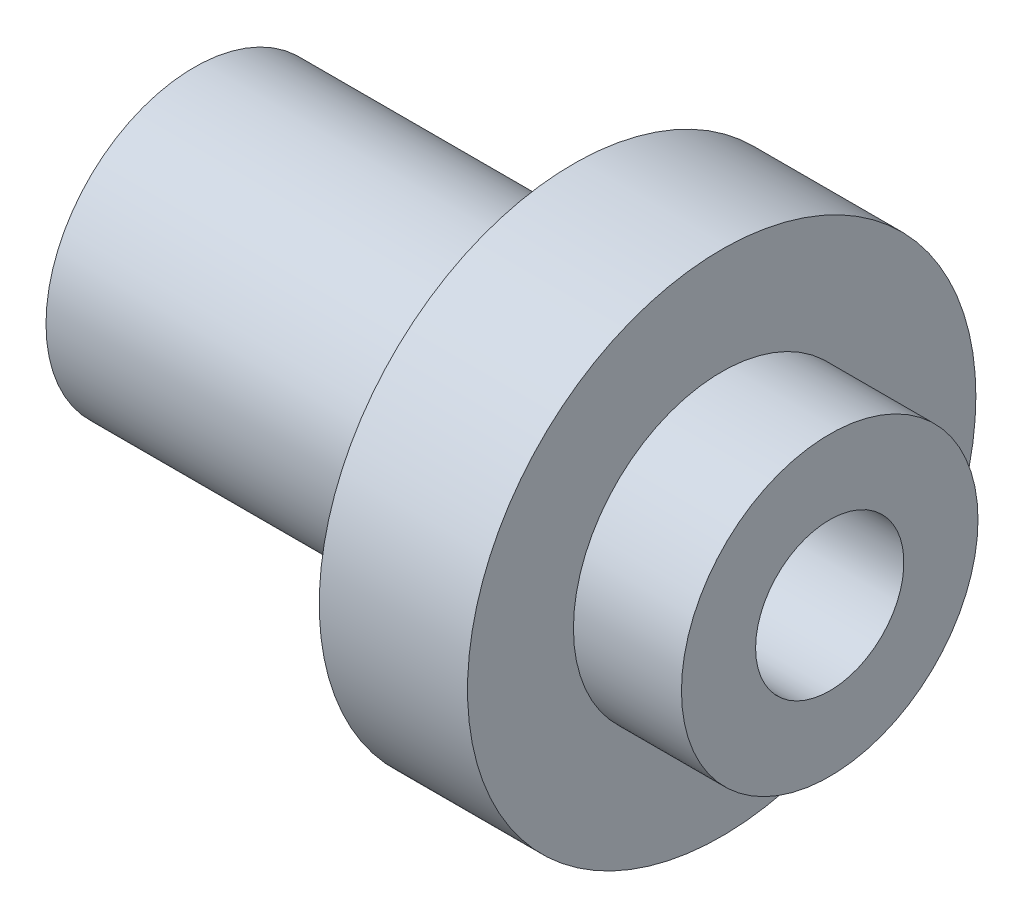
ISO-10303-21;
HEADER;
FILE_DESCRIPTION(('STEP AP214'),'2;1');
FILE_NAME('part.step','',(''),(''),'','','');
FILE_SCHEMA(('AUTOMOTIVE_DESIGN { 1 0 10303 214 1 1 1 1 }'));
ENDSEC;
DATA;
#1=APPLICATION_CONTEXT('core data for automotive mechanical design processes');
#2=APPLICATION_PROTOCOL_DEFINITION('international standard','automotive_design',2000,#1);
#3=PRODUCT_CONTEXT('',#1,'mechanical');
#4=PRODUCT('Part','Part','',(#3));
#5=PRODUCT_RELATED_PRODUCT_CATEGORY('part','',(#4));
#6=PRODUCT_DEFINITION_FORMATION('','',#4);
#7=PRODUCT_DEFINITION_CONTEXT('part definition',#1,'design');
#8=PRODUCT_DEFINITION('design','',#6,#7);
#9=PRODUCT_DEFINITION_SHAPE('','',#8);
#10=(LENGTH_UNIT() NAMED_UNIT(*) SI_UNIT(.MILLI.,.METRE.));
#11=(NAMED_UNIT(*) PLANE_ANGLE_UNIT() SI_UNIT($,.RADIAN.));
#12=(NAMED_UNIT(*) SI_UNIT($,.STERADIAN.) SOLID_ANGLE_UNIT());
#13=UNCERTAINTY_MEASURE_WITH_UNIT(LENGTH_MEASURE(1.E-05),#10,'distance_accuracy_value','');
#14=(GEOMETRIC_REPRESENTATION_CONTEXT(3) GLOBAL_UNCERTAINTY_ASSIGNED_CONTEXT((#13)) GLOBAL_UNIT_ASSIGNED_CONTEXT((#10,
#11,#12)) REPRESENTATION_CONTEXT('',''));
#15=CARTESIAN_POINT('',(0.,0.,0.));
#16=DIRECTION('',(0.,0.,1.));
#17=DIRECTION('',(1.,0.,0.));
#18=AXIS2_PLACEMENT_3D('',#15,#16,#17);
#19=CARTESIAN_POINT('',(-78.343949044586,0.,0.));
#20=DIRECTION('',(-1.,0.,0.));
#21=DIRECTION('',(0.,0.,-1.));
#22=AXIS2_PLACEMENT_3D('',#19,#20,#21);
#23=CYLINDRICAL_SURFACE('',#22,7.00000000000001);
#24=CARTESIAN_POINT('',(-12.1,0.,0.));
#25=DIRECTION('',(1.,0.,0.));
#26=DIRECTION('',(0.,0.,-1.));
#27=AXIS2_PLACEMENT_3D('',#24,#25,#26);
#28=CIRCLE('',#27,7.);
#29=CARTESIAN_POINT('',(-12.1,0.,-7.00000000000007));
#30=VERTEX_POINT('',#29);
#31=EDGE_CURVE('E45',#30,#30,#28,.T.);
#32=ORIENTED_EDGE('',*,*,#31,.F.);
#33=EDGE_LOOP('',(#32));
#34=FACE_BOUND('',#33,.T.);
#35=CARTESIAN_POINT('',(-30.,0.,0.));
#36=DIRECTION('',(-1.,0.,0.));
#37=DIRECTION('',(0.,0.,1.));
#38=AXIS2_PLACEMENT_3D('',#35,#36,#37);
#39=CIRCLE('',#38,7.00000000000005);
#40=CARTESIAN_POINT('',(-30.,0.,7.00000000000005));
#41=VERTEX_POINT('',#40);
#42=EDGE_CURVE('E67',#41,#41,#39,.T.);
#43=ORIENTED_EDGE('',*,*,#42,.F.);
#44=EDGE_LOOP('',(#43));
#45=FACE_BOUND('',#44,.T.);
#46=ADVANCED_FACE('F38',(#34,#45),#23,.T.);
#47=CARTESIAN_POINT('',(-78.343949044586,0.,0.));
#48=DIRECTION('',(-1.,0.,0.));
#49=DIRECTION('',(0.,0.,-1.));
#50=AXIS2_PLACEMENT_3D('',#47,#48,#49);
#51=CYLINDRICAL_SURFACE('',#50,12.);
#52=CARTESIAN_POINT('',(-12.1,0.,0.));
#53=DIRECTION('',(1.,0.,0.));
#54=DIRECTION('',(0.,0.,-1.));
#55=AXIS2_PLACEMENT_3D('',#52,#53,#54);
#56=CIRCLE('',#55,12.);
#57=CARTESIAN_POINT('',(-12.1,0.,-12.0000000000001));
#58=VERTEX_POINT('',#57);
#59=EDGE_CURVE('E10',#58,#58,#56,.T.);
#60=ORIENTED_EDGE('',*,*,#59,.T.);
#61=EDGE_LOOP('',(#60));
#62=FACE_BOUND('',#61,.T.);
#63=CARTESIAN_POINT('',(-5.10000000000001,0.,0.));
#64=DIRECTION('',(1.,0.,0.));
#65=DIRECTION('',(0.,0.,-1.));
#66=AXIS2_PLACEMENT_3D('',#63,#64,#65);
#67=CIRCLE('',#66,12.);
#68=CARTESIAN_POINT('',(-5.10000000000001,0.,-12.0000000000001));
#69=VERTEX_POINT('',#68);
#70=EDGE_CURVE('E58',#69,#69,#67,.T.);
#71=ORIENTED_EDGE('',*,*,#70,.F.);
#72=EDGE_LOOP('',(#71));
#73=FACE_BOUND('',#72,.T.);
#74=ADVANCED_FACE('F40',(#62,#73),#51,.T.);
#75=CARTESIAN_POINT('',(-12.1000000000001,12.0000000000001,0.));
#76=DIRECTION('',(1.,0.,0.));
#77=DIRECTION('',(0.,0.,1.));
#78=AXIS2_PLACEMENT_3D('',#75,#76,#77);
#79=PLANE('',#78);
#80=ORIENTED_EDGE('',*,*,#31,.T.);
#81=EDGE_LOOP('',(#80));
#82=FACE_BOUND('',#81,.T.);
#83=ORIENTED_EDGE('',*,*,#59,.F.);
#84=EDGE_LOOP('',(#83));
#85=FACE_BOUND('',#84,.T.);
#86=ADVANCED_FACE('F82',(#82,#85),#79,.F.);
#87=CARTESIAN_POINT('',(0.,7.,0.));
#88=DIRECTION('',(-1.,0.,0.));
#89=DIRECTION('',(0.,0.,-1.));
#90=AXIS2_PLACEMENT_3D('',#87,#88,#89);
#91=PLANE('',#90);
#92=CARTESIAN_POINT('',(0.,0.,0.));
#93=DIRECTION('',(-1.,0.,0.));
#94=DIRECTION('',(0.,0.,1.));
#95=AXIS2_PLACEMENT_3D('',#92,#93,#94);
#96=CIRCLE('',#95,3.49999999999999);
#97=CARTESIAN_POINT('',(0.,0.,3.5));
#98=VERTEX_POINT('',#97);
#99=EDGE_CURVE('E61',#98,#98,#96,.T.);
#100=ORIENTED_EDGE('',*,*,#99,.T.);
#101=EDGE_LOOP('',(#100));
#102=FACE_BOUND('',#101,.T.);
#103=CARTESIAN_POINT('',(0.,0.,0.));
#104=DIRECTION('',(1.,0.,0.));
#105=DIRECTION('',(0.,0.,-1.));
#106=AXIS2_PLACEMENT_3D('',#103,#104,#105);
#107=CIRCLE('',#106,7.);
#108=CARTESIAN_POINT('',(0.,0.,-7.00000000000003));
#109=VERTEX_POINT('',#108);
#110=EDGE_CURVE('E49',#109,#109,#107,.T.);
#111=ORIENTED_EDGE('',*,*,#110,.T.);
#112=EDGE_LOOP('',(#111));
#113=FACE_BOUND('',#112,.T.);
#114=ADVANCED_FACE('F84',(#102,#113),#91,.F.);
#115=CARTESIAN_POINT('',(-78.343949044586,0.,0.));
#116=DIRECTION('',(-1.,0.,0.));
#117=DIRECTION('',(0.,0.,-1.));
#118=AXIS2_PLACEMENT_3D('',#115,#116,#117);
#119=CYLINDRICAL_SURFACE('',#118,7.);
#120=CARTESIAN_POINT('',(-5.09999999999999,0.,0.));
#121=DIRECTION('',(1.,0.,0.));
#122=DIRECTION('',(0.,0.,-1.));
#123=AXIS2_PLACEMENT_3D('',#120,#121,#122);
#124=CIRCLE('',#123,7.);
#125=CARTESIAN_POINT('',(-5.09999999999999,0.,-7.00000000000003));
#126=VERTEX_POINT('',#125);
#127=EDGE_CURVE('E53',#126,#126,#124,.T.);
#128=ORIENTED_EDGE('',*,*,#127,.T.);
#129=EDGE_LOOP('',(#128));
#130=FACE_BOUND('',#129,.T.);
#131=ORIENTED_EDGE('',*,*,#110,.F.);
#132=EDGE_LOOP('',(#131));
#133=FACE_BOUND('',#132,.T.);
#134=ADVANCED_FACE('F90',(#130,#133),#119,.T.);
#135=CARTESIAN_POINT('',(-5.10000000000007,12.0000000000001,0.));
#136=DIRECTION('',(-1.,0.,0.));
#137=DIRECTION('',(0.,0.,-1.));
#138=AXIS2_PLACEMENT_3D('',#135,#136,#137);
#139=PLANE('',#138);
#140=ORIENTED_EDGE('',*,*,#70,.T.);
#141=EDGE_LOOP('',(#140));
#142=FACE_BOUND('',#141,.T.);
#143=ORIENTED_EDGE('',*,*,#127,.F.);
#144=EDGE_LOOP('',(#143));
#145=FACE_BOUND('',#144,.T.);
#146=ADVANCED_FACE('F96',(#142,#145),#139,.F.);
#147=CARTESIAN_POINT('',(0.,0.,0.));
#148=DIRECTION('',(1.,0.,0.));
#149=DIRECTION('',(0.,0.,1.));
#150=AXIS2_PLACEMENT_3D('',#147,#148,#149);
#151=CYLINDRICAL_SURFACE('',#150,3.49999999999999);
#152=CARTESIAN_POINT('',(-30.,0.,0.));
#153=DIRECTION('',(-1.,0.,0.));
#154=DIRECTION('',(0.,0.,1.));
#155=AXIS2_PLACEMENT_3D('',#152,#153,#154);
#156=CIRCLE('',#155,3.49999999999999);
#157=CARTESIAN_POINT('',(-30.,0.,3.49999999999999));
#158=VERTEX_POINT('',#157);
#159=EDGE_CURVE('E64',#158,#158,#156,.F.);
#160=ORIENTED_EDGE('',*,*,#159,.F.);
#161=EDGE_LOOP('',(#160));
#162=FACE_BOUND('',#161,.T.);
#163=ORIENTED_EDGE('',*,*,#99,.F.);
#164=EDGE_LOOP('',(#163));
#165=FACE_BOUND('',#164,.T.);
#166=ADVANCED_FACE('F103',(#162,#165),#151,.F.);
#167=CARTESIAN_POINT('',(-30.,0.,0.));
#168=DIRECTION('',(-1.,0.,0.));
#169=DIRECTION('',(0.,0.,1.));
#170=AXIS2_PLACEMENT_3D('',#167,#168,#169);
#171=PLANE('',#170);
#172=ORIENTED_EDGE('',*,*,#42,.T.);
#173=EDGE_LOOP('',(#172));
#174=FACE_BOUND('',#173,.T.);
#175=ORIENTED_EDGE('',*,*,#159,.T.);
#176=EDGE_LOOP('',(#175));
#177=FACE_BOUND('',#176,.T.);
#178=ADVANCED_FACE('F71',(#174,#177),#171,.T.);
#179=CLOSED_SHELL('',(#46,#74,#86,#114,#134,#146,#166,#178));
#180=MANIFOLD_SOLID_BREP('B2',#179);
#181=ADVANCED_BREP_SHAPE_REPRESENTATION('',(#18,#180),#14);
#182=SHAPE_DEFINITION_REPRESENTATION(#9,#181);
ENDSEC;
END-ISO-10303-21;
